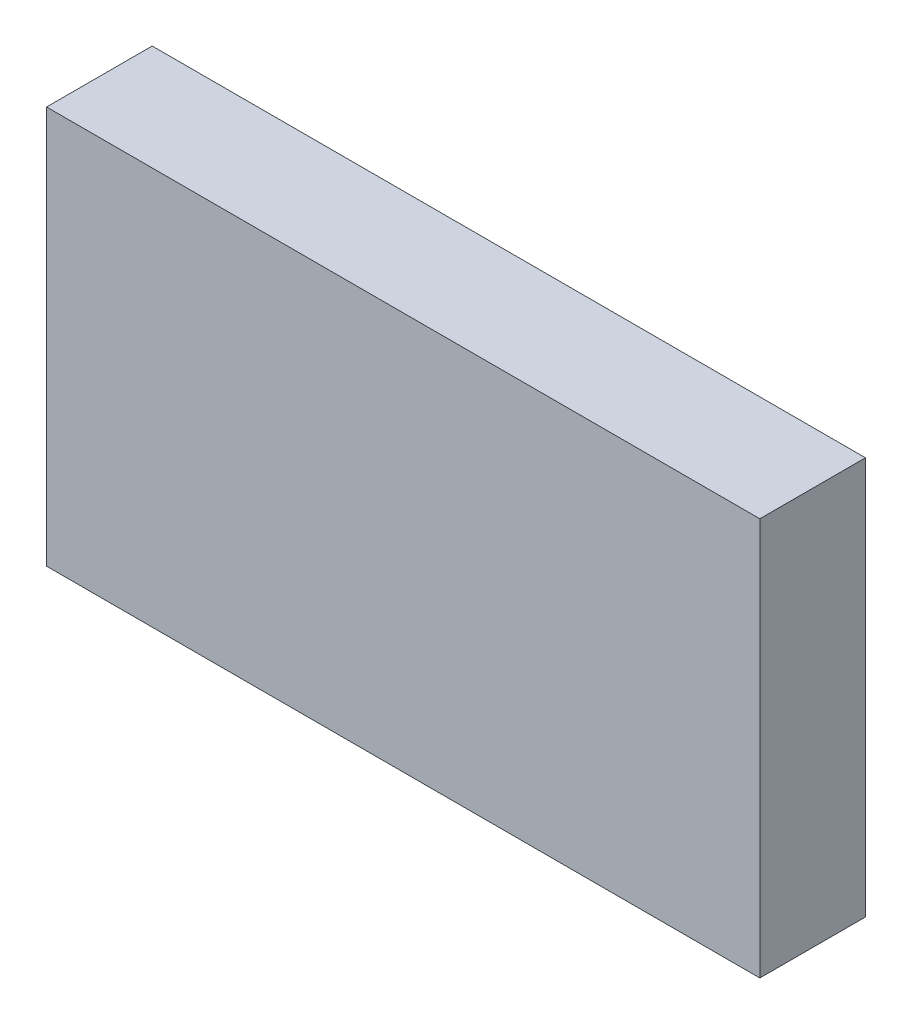
ISO-10303-21;
HEADER;
FILE_DESCRIPTION(('STEP AP214'),'2;1');
FILE_NAME('part.step','',(''),(''),'','','');
FILE_SCHEMA(('AUTOMOTIVE_DESIGN { 1 0 10303 214 1 1 1 1 }'));
ENDSEC;
DATA;
#1=APPLICATION_CONTEXT('core data for automotive mechanical design processes');
#2=APPLICATION_PROTOCOL_DEFINITION('international standard','automotive_design',2000,#1);
#3=PRODUCT_CONTEXT('',#1,'mechanical');
#4=PRODUCT('Part','Part','',(#3));
#5=PRODUCT_RELATED_PRODUCT_CATEGORY('part','',(#4));
#6=PRODUCT_DEFINITION_FORMATION('','',#4);
#7=PRODUCT_DEFINITION_CONTEXT('part definition',#1,'design');
#8=PRODUCT_DEFINITION('design','',#6,#7);
#9=PRODUCT_DEFINITION_SHAPE('','',#8);
#10=(LENGTH_UNIT() NAMED_UNIT(*) SI_UNIT(.MILLI.,.METRE.));
#11=(NAMED_UNIT(*) PLANE_ANGLE_UNIT() SI_UNIT($,.RADIAN.));
#12=(NAMED_UNIT(*) SI_UNIT($,.STERADIAN.) SOLID_ANGLE_UNIT());
#13=UNCERTAINTY_MEASURE_WITH_UNIT(LENGTH_MEASURE(1.E-05),#10,'distance_accuracy_value','');
#14=(GEOMETRIC_REPRESENTATION_CONTEXT(3) GLOBAL_UNCERTAINTY_ASSIGNED_CONTEXT((#13)) GLOBAL_UNIT_ASSIGNED_CONTEXT((#10,
#11,#12)) REPRESENTATION_CONTEXT('',''));
#15=CARTESIAN_POINT('',(0.,0.,0.));
#16=DIRECTION('',(0.,0.,1.));
#17=DIRECTION('',(1.,0.,0.));
#18=AXIS2_PLACEMENT_3D('',#15,#16,#17);
#19=CARTESIAN_POINT('',(-43.2112026299367,42.5133243277579,-7.7));
#20=DIRECTION('',(0.,0.,-1.));
#21=DIRECTION('',(-1.,0.,0.));
#22=AXIS2_PLACEMENT_3D('',#19,#20,#21);
#23=PLANE('',#22);
#24=DIRECTION('',(1.,0.,0.));
#25=VECTOR('',#24,1.);
#26=CARTESIAN_POINT('',(-22.6105130040367,31.0266486555158,-7.7));
#27=LINE('',#26,#25);
#28=CARTESIAN_POINT('',(-63.8118922558368,31.0266486555158,-7.7));
#29=VERTEX_POINT('',#28);
#30=CARTESIAN_POINT('',(-22.6105130040367,31.0266486555158,-7.7));
#31=VERTEX_POINT('',#30);
#32=EDGE_CURVE('E68',#29,#31,#27,.T.);
#33=ORIENTED_EDGE('',*,*,#32,.F.);
#34=DIRECTION('',(0.,1.,0.));
#35=VECTOR('',#34,1.);
#36=CARTESIAN_POINT('',(-63.8118922558368,31.0266486555158,-7.7));
#37=LINE('',#36,#35);
#38=CARTESIAN_POINT('',(-63.8118922558368,54.,-7.7));
#39=VERTEX_POINT('',#38);
#40=EDGE_CURVE('E55',#39,#29,#37,.F.);
#41=ORIENTED_EDGE('',*,*,#40,.F.);
#42=DIRECTION('',(1.,0.,0.));
#43=VECTOR('',#42,1.);
#44=CARTESIAN_POINT('',(-63.8118922558368,54.,-7.7));
#45=LINE('',#44,#43);
#46=CARTESIAN_POINT('',(-22.6105130040367,54.,-7.7));
#47=VERTEX_POINT('',#46);
#48=EDGE_CURVE('E20',#47,#39,#45,.F.);
#49=ORIENTED_EDGE('',*,*,#48,.F.);
#50=DIRECTION('',(0.,1.,0.));
#51=VECTOR('',#50,1.);
#52=CARTESIAN_POINT('',(-22.6105130040367,54.,-7.7));
#53=LINE('',#52,#51);
#54=EDGE_CURVE('E80',#31,#47,#53,.T.);
#55=ORIENTED_EDGE('',*,*,#54,.F.);
#56=EDGE_LOOP('',(#33,#41,#49,#55));
#57=FACE_BOUND('',#56,.T.);
#58=ADVANCED_FACE('F17',(#57),#23,.T.);
#59=CARTESIAN_POINT('',(-63.8118922558368,54.,-1.6));
#60=DIRECTION('',(0.,1.,0.));
#61=DIRECTION('',(0.,0.,1.));
#62=AXIS2_PLACEMENT_3D('',#59,#60,#61);
#63=PLANE('',#62);
#64=ORIENTED_EDGE('',*,*,#48,.T.);
#65=DIRECTION('',(0.,0.,1.));
#66=VECTOR('',#65,1.);
#67=CARTESIAN_POINT('',(-63.8118922558368,54.,-1.6));
#68=LINE('',#67,#66);
#69=CARTESIAN_POINT('',(-63.8118922558368,54.,-1.6));
#70=VERTEX_POINT('',#69);
#71=EDGE_CURVE('E61',#70,#39,#68,.F.);
#72=ORIENTED_EDGE('',*,*,#71,.F.);
#73=DIRECTION('',(1.,0.,0.));
#74=VECTOR('',#73,1.);
#75=CARTESIAN_POINT('',(-43.2112026299367,54.,-1.6));
#76=LINE('',#75,#74);
#77=CARTESIAN_POINT('',(-22.6105130040367,54.,-1.6));
#78=VERTEX_POINT('',#77);
#79=EDGE_CURVE('E83',#78,#70,#76,.F.);
#80=ORIENTED_EDGE('',*,*,#79,.F.);
#81=DIRECTION('',(0.,0.,-1.));
#82=VECTOR('',#81,1.);
#83=CARTESIAN_POINT('',(-22.6105130040367,54.,-1.6));
#84=LINE('',#83,#82);
#85=EDGE_CURVE('E64',#47,#78,#84,.F.);
#86=ORIENTED_EDGE('',*,*,#85,.F.);
#87=EDGE_LOOP('',(#64,#72,#80,#86));
#88=FACE_BOUND('',#87,.T.);
#89=ADVANCED_FACE('F60',(#88),#63,.T.);
#90=CARTESIAN_POINT('',(-63.8118922558368,31.0266486555158,-1.6));
#91=DIRECTION('',(-1.,0.,0.));
#92=DIRECTION('',(0.,0.,1.));
#93=AXIS2_PLACEMENT_3D('',#90,#91,#92);
#94=PLANE('',#93);
#95=ORIENTED_EDGE('',*,*,#40,.T.);
#96=DIRECTION('',(0.,0.,-1.));
#97=VECTOR('',#96,1.);
#98=CARTESIAN_POINT('',(-63.8118922558368,31.0266486555158,-1.6));
#99=LINE('',#98,#97);
#100=CARTESIAN_POINT('',(-63.8118922558368,31.0266486555158,-1.6));
#101=VERTEX_POINT('',#100);
#102=EDGE_CURVE('E70',#101,#29,#99,.T.);
#103=ORIENTED_EDGE('',*,*,#102,.F.);
#104=DIRECTION('',(0.,1.,0.));
#105=VECTOR('',#104,1.);
#106=CARTESIAN_POINT('',(-63.8118922558368,42.5133243277579,-1.6));
#107=LINE('',#106,#105);
#108=EDGE_CURVE('E74',#70,#101,#107,.F.);
#109=ORIENTED_EDGE('',*,*,#108,.F.);
#110=ORIENTED_EDGE('',*,*,#71,.T.);
#111=EDGE_LOOP('',(#95,#103,#109,#110));
#112=FACE_BOUND('',#111,.T.);
#113=ADVANCED_FACE('F72',(#112),#94,.T.);
#114=CARTESIAN_POINT('',(-22.6105130040367,31.0266486555158,-1.6));
#115=DIRECTION('',(0.,-1.,0.));
#116=DIRECTION('',(0.,0.,-1.));
#117=AXIS2_PLACEMENT_3D('',#114,#115,#116);
#118=PLANE('',#117);
#119=ORIENTED_EDGE('',*,*,#32,.T.);
#120=DIRECTION('',(0.,0.,-1.));
#121=VECTOR('',#120,1.);
#122=CARTESIAN_POINT('',(-22.6105130040367,31.0266486555158,-1.6));
#123=LINE('',#122,#121);
#124=CARTESIAN_POINT('',(-22.6105130040367,31.0266486555158,-1.6));
#125=VERTEX_POINT('',#124);
#126=EDGE_CURVE('E35',#125,#31,#123,.T.);
#127=ORIENTED_EDGE('',*,*,#126,.F.);
#128=DIRECTION('',(1.,0.,0.));
#129=VECTOR('',#128,1.);
#130=CARTESIAN_POINT('',(-43.2112026299367,31.0266486555158,-1.6));
#131=LINE('',#130,#129);
#132=EDGE_CURVE('E26',#101,#125,#131,.T.);
#133=ORIENTED_EDGE('',*,*,#132,.F.);
#134=ORIENTED_EDGE('',*,*,#102,.T.);
#135=EDGE_LOOP('',(#119,#127,#133,#134));
#136=FACE_BOUND('',#135,.T.);
#137=ADVANCED_FACE('F89',(#136),#118,.T.);
#138=CARTESIAN_POINT('',(-22.6105130040367,54.,-1.6));
#139=DIRECTION('',(1.,0.,0.));
#140=DIRECTION('',(0.,0.,-1.));
#141=AXIS2_PLACEMENT_3D('',#138,#139,#140);
#142=PLANE('',#141);
#143=ORIENTED_EDGE('',*,*,#54,.T.);
#144=ORIENTED_EDGE('',*,*,#85,.T.);
#145=DIRECTION('',(0.,1.,0.));
#146=VECTOR('',#145,1.);
#147=CARTESIAN_POINT('',(-22.6105130040367,42.5133243277579,-1.6));
#148=LINE('',#147,#146);
#149=EDGE_CURVE('E11',#125,#78,#148,.T.);
#150=ORIENTED_EDGE('',*,*,#149,.F.);
#151=ORIENTED_EDGE('',*,*,#126,.T.);
#152=EDGE_LOOP('',(#143,#144,#150,#151));
#153=FACE_BOUND('',#152,.T.);
#154=ADVANCED_FACE('F91',(#153),#142,.T.);
#155=CARTESIAN_POINT('',(-43.2112026299367,42.5133243277579,-1.6));
#156=DIRECTION('',(0.,0.,1.));
#157=DIRECTION('',(1.,0.,0.));
#158=AXIS2_PLACEMENT_3D('',#155,#156,#157);
#159=PLANE('',#158);
#160=ORIENTED_EDGE('',*,*,#132,.T.);
#161=ORIENTED_EDGE('',*,*,#149,.T.);
#162=ORIENTED_EDGE('',*,*,#79,.T.);
#163=ORIENTED_EDGE('',*,*,#108,.T.);
#164=EDGE_LOOP('',(#160,#161,#162,#163));
#165=FACE_BOUND('',#164,.T.);
#166=ADVANCED_FACE('F88',(#165),#159,.T.);
#167=CLOSED_SHELL('',(#58,#89,#113,#137,#154,#166));
#168=MANIFOLD_SOLID_BREP('B1',#167);
#169=ADVANCED_BREP_SHAPE_REPRESENTATION('',(#18,#168),#14);
#170=SHAPE_DEFINITION_REPRESENTATION(#9,#169);
ENDSEC;
END-ISO-10303-21;
